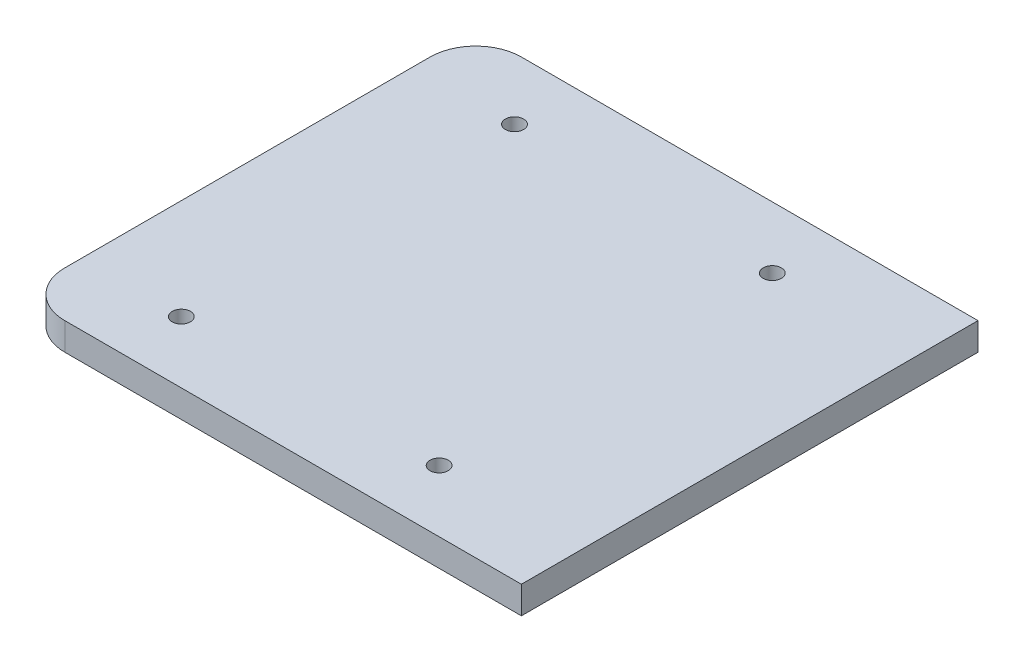
ISO-10303-21;
HEADER;
FILE_DESCRIPTION(('STEP AP214'),'2;1');
FILE_NAME('part.step','',(''),(''),'','','');
FILE_SCHEMA(('AUTOMOTIVE_DESIGN { 1 0 10303 214 1 1 1 1 }'));
ENDSEC;
DATA;
#1=APPLICATION_CONTEXT('core data for automotive mechanical design processes');
#2=APPLICATION_PROTOCOL_DEFINITION('international standard','automotive_design',2000,#1);
#3=PRODUCT_CONTEXT('',#1,'mechanical');
#4=PRODUCT('Part','Part','',(#3));
#5=PRODUCT_RELATED_PRODUCT_CATEGORY('part','',(#4));
#6=PRODUCT_DEFINITION_FORMATION('','',#4);
#7=PRODUCT_DEFINITION_CONTEXT('part definition',#1,'design');
#8=PRODUCT_DEFINITION('design','',#6,#7);
#9=PRODUCT_DEFINITION_SHAPE('','',#8);
#10=(LENGTH_UNIT() NAMED_UNIT(*) SI_UNIT(.MILLI.,.METRE.));
#11=(NAMED_UNIT(*) PLANE_ANGLE_UNIT() SI_UNIT($,.RADIAN.));
#12=(NAMED_UNIT(*) SI_UNIT($,.STERADIAN.) SOLID_ANGLE_UNIT());
#13=UNCERTAINTY_MEASURE_WITH_UNIT(LENGTH_MEASURE(1.E-05),#10,'distance_accuracy_value','');
#14=(GEOMETRIC_REPRESENTATION_CONTEXT(3) GLOBAL_UNCERTAINTY_ASSIGNED_CONTEXT((#13)) GLOBAL_UNIT_ASSIGNED_CONTEXT((#10,
#11,#12)) REPRESENTATION_CONTEXT('',''));
#15=CARTESIAN_POINT('',(0.,0.,0.));
#16=DIRECTION('',(0.,0.,1.));
#17=DIRECTION('',(1.,0.,0.));
#18=AXIS2_PLACEMENT_3D('',#15,#16,#17);
#19=CARTESIAN_POINT('',(-49.9999999999999,6.00000000000001,50.));
#20=DIRECTION('',(1.,0.,0.));
#21=DIRECTION('',(0.,0.,-1.));
#22=AXIS2_PLACEMENT_3D('',#19,#20,#21);
#23=PLANE('',#22);
#24=DIRECTION('',(0.,0.,1.));
#25=VECTOR('',#24,1.);
#26=CARTESIAN_POINT('',(-49.9999999999999,6.00000000000001,50.));
#27=LINE('',#26,#25);
#28=CARTESIAN_POINT('',(-49.9999999999999,6.00000000000001,-40.));
#29=VERTEX_POINT('',#28);
#30=CARTESIAN_POINT('',(-49.9999999999999,6.00000000000001,40.0000000000001));
#31=VERTEX_POINT('',#30);
#32=EDGE_CURVE('E105',#29,#31,#27,.T.);
#33=ORIENTED_EDGE('',*,*,#32,.F.);
#34=DIRECTION('',(0.,-1.,0.));
#35=VECTOR('',#34,1.);
#36=CARTESIAN_POINT('',(-49.9999999999999,6.00000000000001,-40.));
#37=LINE('',#36,#35);
#38=CARTESIAN_POINT('',(-49.9999999999999,0.,-40.));
#39=VERTEX_POINT('',#38);
#40=EDGE_CURVE('E136',#29,#39,#37,.T.);
#41=ORIENTED_EDGE('',*,*,#40,.T.);
#42=DIRECTION('',(0.,0.,1.));
#43=VECTOR('',#42,1.);
#44=CARTESIAN_POINT('',(-49.9999999999999,0.,50.));
#45=LINE('',#44,#43);
#46=CARTESIAN_POINT('',(-49.9999999999999,0.,40.0000000000001));
#47=VERTEX_POINT('',#46);
#48=EDGE_CURVE('E125',#39,#47,#45,.T.);
#49=ORIENTED_EDGE('',*,*,#48,.T.);
#50=DIRECTION('',(0.,-1.,0.));
#51=VECTOR('',#50,1.);
#52=CARTESIAN_POINT('',(-49.9999999999999,6.00000000000001,40.0000000000001));
#53=LINE('',#52,#51);
#54=EDGE_CURVE('E115',#47,#31,#53,.F.);
#55=ORIENTED_EDGE('',*,*,#54,.T.);
#56=EDGE_LOOP('',(#33,#41,#49,#55));
#57=FACE_BOUND('',#56,.T.);
#58=ADVANCED_FACE('F44',(#57),#23,.F.);
#59=CARTESIAN_POINT('',(60.,5.99999999999997,50.));
#60=DIRECTION('',(0.,0.,-1.));
#61=DIRECTION('',(-1.,0.,0.));
#62=AXIS2_PLACEMENT_3D('',#59,#60,#61);
#63=PLANE('',#62);
#64=DIRECTION('',(1.,0.,0.));
#65=VECTOR('',#64,1.);
#66=CARTESIAN_POINT('',(50.,5.99999999999997,50.));
#67=LINE('',#66,#65);
#68=CARTESIAN_POINT('',(-39.9999999999999,6.00000000000001,50.));
#69=VERTEX_POINT('',#68);
#70=CARTESIAN_POINT('',(60.,5.99999999999997,50.));
#71=VERTEX_POINT('',#70);
#72=EDGE_CURVE('E97',#69,#71,#67,.T.);
#73=ORIENTED_EDGE('',*,*,#72,.F.);
#74=DIRECTION('',(0.,-1.,0.));
#75=VECTOR('',#74,1.);
#76=CARTESIAN_POINT('',(-39.9999999999999,6.00000000000001,50.0000000000001));
#77=LINE('',#76,#75);
#78=CARTESIAN_POINT('',(-39.9999999999999,0.,50.0000000000001));
#79=VERTEX_POINT('',#78);
#80=EDGE_CURVE('E13',#69,#79,#77,.T.);
#81=ORIENTED_EDGE('',*,*,#80,.T.);
#82=DIRECTION('',(1.,0.,0.));
#83=VECTOR('',#82,1.);
#84=CARTESIAN_POINT('',(60.,0.,50.));
#85=LINE('',#84,#83);
#86=CARTESIAN_POINT('',(60.,0.,50.));
#87=VERTEX_POINT('',#86);
#88=EDGE_CURVE('E111',#79,#87,#85,.T.);
#89=ORIENTED_EDGE('',*,*,#88,.T.);
#90=DIRECTION('',(0.,-1.,0.));
#91=VECTOR('',#90,1.);
#92=CARTESIAN_POINT('',(60.,5.99999999999997,50.));
#93=LINE('',#92,#91);
#94=EDGE_CURVE('E108',#71,#87,#93,.T.);
#95=ORIENTED_EDGE('',*,*,#94,.F.);
#96=EDGE_LOOP('',(#73,#81,#89,#95));
#97=FACE_BOUND('',#96,.T.);
#98=ADVANCED_FACE('F109',(#97),#63,.F.);
#99=CARTESIAN_POINT('',(60.,5.99999999999997,-50.));
#100=DIRECTION('',(-1.,0.,0.));
#101=DIRECTION('',(0.,0.,1.));
#102=AXIS2_PLACEMENT_3D('',#99,#100,#101);
#103=PLANE('',#102);
#104=DIRECTION('',(0.,0.,-1.));
#105=VECTOR('',#104,1.);
#106=CARTESIAN_POINT('',(60.,0.,-50.));
#107=LINE('',#106,#105);
#108=CARTESIAN_POINT('',(60.,0.,-50.));
#109=VERTEX_POINT('',#108);
#110=EDGE_CURVE('E130',#87,#109,#107,.T.);
#111=ORIENTED_EDGE('',*,*,#110,.T.);
#112=DIRECTION('',(0.,-1.,0.));
#113=VECTOR('',#112,1.);
#114=CARTESIAN_POINT('',(60.,5.99999999999997,-50.));
#115=LINE('',#114,#113);
#116=CARTESIAN_POINT('',(60.,5.99999999999997,-50.));
#117=VERTEX_POINT('',#116);
#118=EDGE_CURVE('E116',#117,#109,#115,.T.);
#119=ORIENTED_EDGE('',*,*,#118,.F.);
#120=DIRECTION('',(0.,0.,-1.));
#121=VECTOR('',#120,1.);
#122=CARTESIAN_POINT('',(60.,5.99999999999997,-50.));
#123=LINE('',#122,#121);
#124=EDGE_CURVE('E101',#71,#117,#123,.T.);
#125=ORIENTED_EDGE('',*,*,#124,.F.);
#126=ORIENTED_EDGE('',*,*,#94,.T.);
#127=EDGE_LOOP('',(#111,#119,#125,#126));
#128=FACE_BOUND('',#127,.T.);
#129=ADVANCED_FACE('F118',(#128),#103,.F.);
#130=CARTESIAN_POINT('',(50.,5.99999999999997,-50.));
#131=DIRECTION('',(0.,0.,1.));
#132=DIRECTION('',(1.,0.,0.));
#133=AXIS2_PLACEMENT_3D('',#130,#131,#132);
#134=PLANE('',#133);
#135=DIRECTION('',(-1.,0.,0.));
#136=VECTOR('',#135,1.);
#137=CARTESIAN_POINT('',(50.,0.,-50.));
#138=LINE('',#137,#136);
#139=CARTESIAN_POINT('',(-39.9999999999999,0.,-50.));
#140=VERTEX_POINT('',#139);
#141=EDGE_CURVE('E132',#109,#140,#138,.T.);
#142=ORIENTED_EDGE('',*,*,#141,.T.);
#143=DIRECTION('',(0.,-1.,0.));
#144=VECTOR('',#143,1.);
#145=CARTESIAN_POINT('',(-39.9999999999999,6.00000000000001,-50.));
#146=LINE('',#145,#144);
#147=CARTESIAN_POINT('',(-39.9999999999999,6.00000000000001,-49.9999999999999));
#148=VERTEX_POINT('',#147);
#149=EDGE_CURVE('E67',#140,#148,#146,.F.);
#150=ORIENTED_EDGE('',*,*,#149,.T.);
#151=DIRECTION('',(-1.,0.,0.));
#152=VECTOR('',#151,1.);
#153=CARTESIAN_POINT('',(50.,5.99999999999997,-50.));
#154=LINE('',#153,#152);
#155=EDGE_CURVE('E120',#117,#148,#154,.T.);
#156=ORIENTED_EDGE('',*,*,#155,.F.);
#157=ORIENTED_EDGE('',*,*,#118,.T.);
#158=EDGE_LOOP('',(#142,#150,#156,#157));
#159=FACE_BOUND('',#158,.T.);
#160=ADVANCED_FACE('F154',(#159),#134,.F.);
#161=CARTESIAN_POINT('',(0.,6.00000000000001,0.));
#162=DIRECTION('',(0.,1.,0.));
#163=DIRECTION('',(0.,0.,1.));
#164=AXIS2_PLACEMENT_3D('',#161,#162,#163);
#165=PLANE('',#164);
#166=CARTESIAN_POINT('',(-27.9999999999997,6.00000000000001,-36.4831094633033));
#167=DIRECTION('',(0.,1.,0.));
#168=DIRECTION('',(0.,0.,1.));
#169=AXIS2_PLACEMENT_3D('',#166,#167,#168);
#170=CIRCLE('',#169,1.99999999999999);
#171=CARTESIAN_POINT('',(-27.9999999999997,6.00000000000001,-34.4831094633033));
#172=VERTEX_POINT('',#171);
#173=EDGE_CURVE('E203',#172,#172,#170,.T.);
#174=ORIENTED_EDGE('',*,*,#173,.F.);
#175=EDGE_LOOP('',(#174));
#176=FACE_BOUND('',#175,.T.);
#177=CARTESIAN_POINT('',(28.4631060556123,5.99999999999998,-36.4831094633033));
#178=DIRECTION('',(0.,1.,0.));
#179=DIRECTION('',(0.,0.,1.));
#180=AXIS2_PLACEMENT_3D('',#177,#178,#179);
#181=CIRCLE('',#180,1.99999999999999);
#182=CARTESIAN_POINT('',(28.4631060556123,5.99999999999998,-34.4831094633033));
#183=VERTEX_POINT('',#182);
#184=EDGE_CURVE('E206',#183,#183,#181,.T.);
#185=ORIENTED_EDGE('',*,*,#184,.F.);
#186=EDGE_LOOP('',(#185));
#187=FACE_BOUND('',#186,.T.);
#188=CARTESIAN_POINT('',(-27.9999999999996,6.00000000000001,36.4831094633034));
#189=DIRECTION('',(0.,1.,0.));
#190=DIRECTION('',(0.,0.,1.));
#191=AXIS2_PLACEMENT_3D('',#188,#189,#190);
#192=CIRCLE('',#191,1.99999999999999);
#193=CARTESIAN_POINT('',(-27.9999999999996,6.00000000000001,38.4831094633034));
#194=VERTEX_POINT('',#193);
#195=EDGE_CURVE('E215',#194,#194,#192,.T.);
#196=ORIENTED_EDGE('',*,*,#195,.F.);
#197=EDGE_LOOP('',(#196));
#198=FACE_BOUND('',#197,.T.);
#199=CARTESIAN_POINT('',(28.4631060556122,5.99999999999998,36.4831094633034));
#200=DIRECTION('',(0.,1.,0.));
#201=DIRECTION('',(0.,0.,1.));
#202=AXIS2_PLACEMENT_3D('',#199,#200,#201);
#203=CIRCLE('',#202,1.99999999999999);
#204=CARTESIAN_POINT('',(28.4631060556122,5.99999999999998,38.4831094633034));
#205=VERTEX_POINT('',#204);
#206=EDGE_CURVE('E221',#205,#205,#203,.T.);
#207=ORIENTED_EDGE('',*,*,#206,.F.);
#208=EDGE_LOOP('',(#207));
#209=FACE_BOUND('',#208,.T.);
#210=ORIENTED_EDGE('',*,*,#155,.T.);
#211=CARTESIAN_POINT('',(-39.9999999999999,6.00000000000001,-40.));
#212=DIRECTION('',(0.,1.,0.));
#213=DIRECTION('',(0.,0.,1.));
#214=AXIS2_PLACEMENT_3D('',#211,#212,#213);
#215=CIRCLE('',#214,10.);
#216=EDGE_CURVE('E52',#148,#29,#215,.T.);
#217=ORIENTED_EDGE('',*,*,#216,.T.);
#218=ORIENTED_EDGE('',*,*,#32,.T.);
#219=CARTESIAN_POINT('',(-39.9999999999999,6.00000000000001,40.0000000000001));
#220=DIRECTION('',(0.,1.,0.));
#221=DIRECTION('',(0.,0.,1.));
#222=AXIS2_PLACEMENT_3D('',#219,#220,#221);
#223=CIRCLE('',#222,10.);
#224=EDGE_CURVE('E59',#31,#69,#223,.T.);
#225=ORIENTED_EDGE('',*,*,#224,.T.);
#226=ORIENTED_EDGE('',*,*,#72,.T.);
#227=ORIENTED_EDGE('',*,*,#124,.T.);
#228=EDGE_LOOP('',(#210,#217,#218,#225,#226,#227));
#229=FACE_BOUND('',#228,.T.);
#230=ADVANCED_FACE('F99',(#176,#187,#198,#209,#229),#165,.T.);
#231=CARTESIAN_POINT('',(0.,0.,0.));
#232=DIRECTION('',(0.,1.,0.));
#233=DIRECTION('',(0.,0.,1.));
#234=AXIS2_PLACEMENT_3D('',#231,#232,#233);
#235=PLANE('',#234);
#236=CARTESIAN_POINT('',(-27.9999999999997,0.,-36.4831094633033));
#237=DIRECTION('',(0.,1.,0.));
#238=DIRECTION('',(0.,0.,1.));
#239=AXIS2_PLACEMENT_3D('',#236,#237,#238);
#240=CIRCLE('',#239,1.99999999999998);
#241=CARTESIAN_POINT('',(-27.9999999999997,0.,-34.4831094633033));
#242=VERTEX_POINT('',#241);
#243=EDGE_CURVE('E205',#242,#242,#240,.T.);
#244=ORIENTED_EDGE('',*,*,#243,.T.);
#245=EDGE_LOOP('',(#244));
#246=FACE_BOUND('',#245,.T.);
#247=CARTESIAN_POINT('',(28.4631060556123,0.,-36.4831094633033));
#248=DIRECTION('',(0.,1.,0.));
#249=DIRECTION('',(0.,0.,1.));
#250=AXIS2_PLACEMENT_3D('',#247,#248,#249);
#251=CIRCLE('',#250,1.99999999999998);
#252=CARTESIAN_POINT('',(28.4631060556123,0.,-34.4831094633033));
#253=VERTEX_POINT('',#252);
#254=EDGE_CURVE('E209',#253,#253,#251,.T.);
#255=ORIENTED_EDGE('',*,*,#254,.T.);
#256=EDGE_LOOP('',(#255));
#257=FACE_BOUND('',#256,.T.);
#258=CARTESIAN_POINT('',(-27.9999999999996,0.,36.4831094633034));
#259=DIRECTION('',(0.,1.,0.));
#260=DIRECTION('',(0.,0.,1.));
#261=AXIS2_PLACEMENT_3D('',#258,#259,#260);
#262=CIRCLE('',#261,1.99999999999998);
#263=CARTESIAN_POINT('',(-27.9999999999996,0.,38.4831094633034));
#264=VERTEX_POINT('',#263);
#265=EDGE_CURVE('E218',#264,#264,#262,.T.);
#266=ORIENTED_EDGE('',*,*,#265,.T.);
#267=EDGE_LOOP('',(#266));
#268=FACE_BOUND('',#267,.T.);
#269=CARTESIAN_POINT('',(28.4631060556122,0.,36.4831094633034));
#270=DIRECTION('',(0.,1.,0.));
#271=DIRECTION('',(0.,0.,1.));
#272=AXIS2_PLACEMENT_3D('',#269,#270,#271);
#273=CIRCLE('',#272,1.99999999999998);
#274=CARTESIAN_POINT('',(28.4631060556122,0.,38.4831094633034));
#275=VERTEX_POINT('',#274);
#276=EDGE_CURVE('E128',#275,#275,#273,.T.);
#277=ORIENTED_EDGE('',*,*,#276,.T.);
#278=EDGE_LOOP('',(#277));
#279=FACE_BOUND('',#278,.T.);
#280=ORIENTED_EDGE('',*,*,#48,.F.);
#281=CARTESIAN_POINT('',(-39.9999999999999,0.,-40.));
#282=DIRECTION('',(0.,1.,0.));
#283=DIRECTION('',(0.,0.,1.));
#284=AXIS2_PLACEMENT_3D('',#281,#282,#283);
#285=CIRCLE('',#284,10.);
#286=EDGE_CURVE('E141',#39,#140,#285,.F.);
#287=ORIENTED_EDGE('',*,*,#286,.T.);
#288=ORIENTED_EDGE('',*,*,#141,.F.);
#289=ORIENTED_EDGE('',*,*,#110,.F.);
#290=ORIENTED_EDGE('',*,*,#88,.F.);
#291=CARTESIAN_POINT('',(-39.9999999999999,0.,40.0000000000001));
#292=DIRECTION('',(0.,1.,0.));
#293=DIRECTION('',(0.,0.,1.));
#294=AXIS2_PLACEMENT_3D('',#291,#292,#293);
#295=CIRCLE('',#294,10.);
#296=EDGE_CURVE('E139',#79,#47,#295,.F.);
#297=ORIENTED_EDGE('',*,*,#296,.T.);
#298=EDGE_LOOP('',(#280,#287,#288,#289,#290,#297));
#299=FACE_BOUND('',#298,.T.);
#300=ADVANCED_FACE('F153',(#246,#257,#268,#279,#299),#235,.F.);
#301=CARTESIAN_POINT('',(-39.9999999999999,6.00000000000001,-40.));
#302=DIRECTION('',(0.,-1.,0.));
#303=DIRECTION('',(0.,0.,-1.));
#304=AXIS2_PLACEMENT_3D('',#301,#302,#303);
#305=CYLINDRICAL_SURFACE('',#304,10.);
#306=ORIENTED_EDGE('',*,*,#216,.F.);
#307=ORIENTED_EDGE('',*,*,#149,.F.);
#308=ORIENTED_EDGE('',*,*,#286,.F.);
#309=ORIENTED_EDGE('',*,*,#40,.F.);
#310=EDGE_LOOP('',(#306,#307,#308,#309));
#311=FACE_BOUND('',#310,.T.);
#312=ADVANCED_FACE('F151',(#311),#305,.T.);
#313=CARTESIAN_POINT('',(-39.9999999999999,6.00000000000001,40.0000000000001));
#314=DIRECTION('',(0.,-1.,0.));
#315=DIRECTION('',(0.,0.,-1.));
#316=AXIS2_PLACEMENT_3D('',#313,#314,#315);
#317=CYLINDRICAL_SURFACE('',#316,10.);
#318=ORIENTED_EDGE('',*,*,#224,.F.);
#319=ORIENTED_EDGE('',*,*,#54,.F.);
#320=ORIENTED_EDGE('',*,*,#296,.F.);
#321=ORIENTED_EDGE('',*,*,#80,.F.);
#322=EDGE_LOOP('',(#318,#319,#320,#321));
#323=FACE_BOUND('',#322,.T.);
#324=ADVANCED_FACE('F46',(#323),#317,.T.);
#325=CARTESIAN_POINT('',(28.4631060556122,5.99999999999998,36.4831094633034));
#326=DIRECTION('',(0.,1.,0.));
#327=DIRECTION('',(0.,0.,1.));
#328=AXIS2_PLACEMENT_3D('',#325,#326,#327);
#329=CYLINDRICAL_SURFACE('',#328,1.99999999999998);
#330=ORIENTED_EDGE('',*,*,#206,.T.);
#331=EDGE_LOOP('',(#330));
#332=FACE_BOUND('',#331,.T.);
#333=ORIENTED_EDGE('',*,*,#276,.F.);
#334=EDGE_LOOP('',(#333));
#335=FACE_BOUND('',#334,.T.);
#336=ADVANCED_FACE('F176',(#332,#335),#329,.F.);
#337=CARTESIAN_POINT('',(-27.9999999999996,6.00000000000001,36.4831094633034));
#338=DIRECTION('',(0.,1.,0.));
#339=DIRECTION('',(0.,0.,1.));
#340=AXIS2_PLACEMENT_3D('',#337,#338,#339);
#341=CYLINDRICAL_SURFACE('',#340,1.99999999999998);
#342=ORIENTED_EDGE('',*,*,#195,.T.);
#343=EDGE_LOOP('',(#342));
#344=FACE_BOUND('',#343,.T.);
#345=ORIENTED_EDGE('',*,*,#265,.F.);
#346=EDGE_LOOP('',(#345));
#347=FACE_BOUND('',#346,.T.);
#348=ADVANCED_FACE('F186',(#344,#347),#341,.F.);
#349=CARTESIAN_POINT('',(28.4631060556123,5.99999999999998,-36.4831094633033));
#350=DIRECTION('',(0.,1.,0.));
#351=DIRECTION('',(0.,0.,1.));
#352=AXIS2_PLACEMENT_3D('',#349,#350,#351);
#353=CYLINDRICAL_SURFACE('',#352,1.99999999999998);
#354=ORIENTED_EDGE('',*,*,#184,.T.);
#355=EDGE_LOOP('',(#354));
#356=FACE_BOUND('',#355,.T.);
#357=ORIENTED_EDGE('',*,*,#254,.F.);
#358=EDGE_LOOP('',(#357));
#359=FACE_BOUND('',#358,.T.);
#360=ADVANCED_FACE('F190',(#356,#359),#353,.F.);
#361=CARTESIAN_POINT('',(-27.9999999999997,6.00000000000001,-36.4831094633033));
#362=DIRECTION('',(0.,1.,0.));
#363=DIRECTION('',(0.,0.,1.));
#364=AXIS2_PLACEMENT_3D('',#361,#362,#363);
#365=CYLINDRICAL_SURFACE('',#364,1.99999999999998);
#366=ORIENTED_EDGE('',*,*,#173,.T.);
#367=EDGE_LOOP('',(#366));
#368=FACE_BOUND('',#367,.T.);
#369=ORIENTED_EDGE('',*,*,#243,.F.);
#370=EDGE_LOOP('',(#369));
#371=FACE_BOUND('',#370,.T.);
#372=ADVANCED_FACE('F194',(#368,#371),#365,.F.);
#373=CLOSED_SHELL('',(#58,#98,#129,#160,#230,#300,#312,#324,#336,#348,#360,#372));
#374=MANIFOLD_SOLID_BREP('B2',#373);
#375=ADVANCED_BREP_SHAPE_REPRESENTATION('',(#18,#374),#14);
#376=SHAPE_DEFINITION_REPRESENTATION(#9,#375);
ENDSEC;
END-ISO-10303-21;
